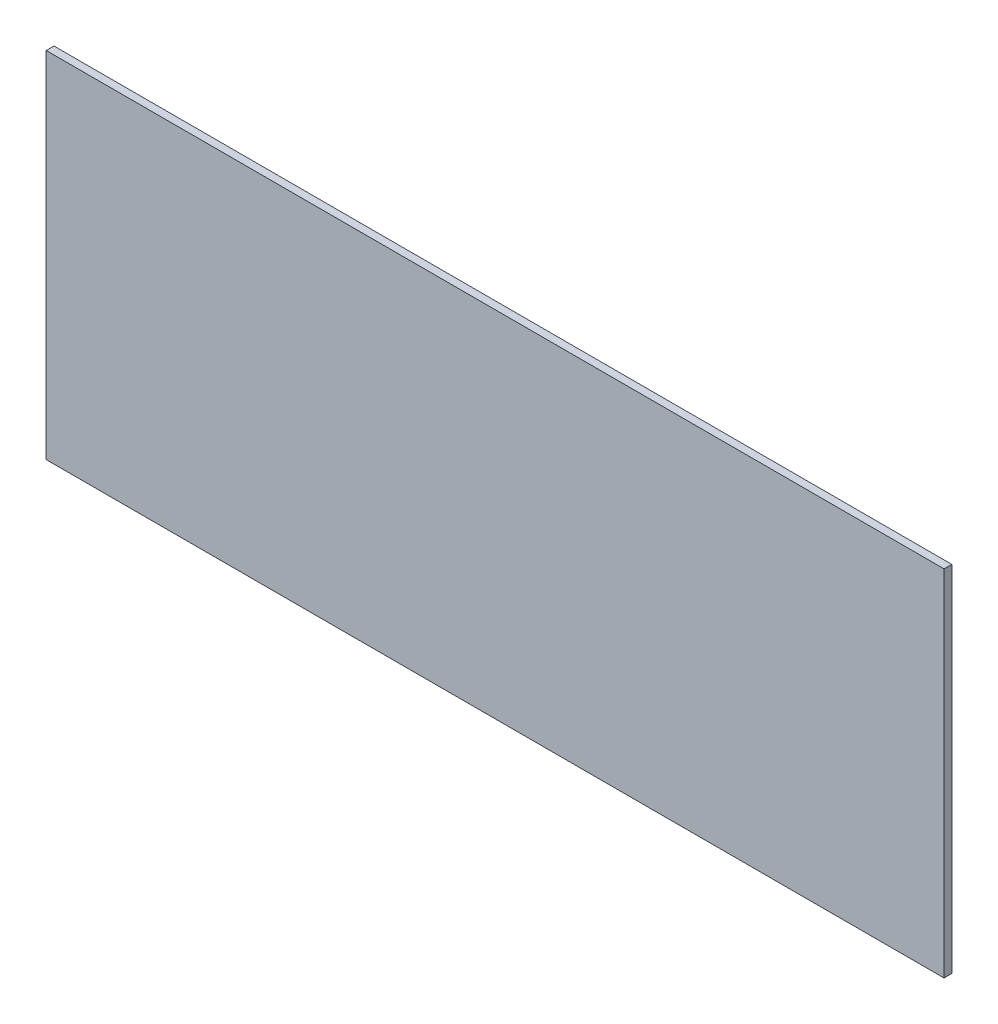
ISO-10303-21;
HEADER;
FILE_DESCRIPTION(('STEP AP214'),'2;1');
FILE_NAME('part.step','',(''),(''),'','','');
FILE_SCHEMA(('AUTOMOTIVE_DESIGN { 1 0 10303 214 1 1 1 1 }'));
ENDSEC;
DATA;
#1=APPLICATION_CONTEXT('core data for automotive mechanical design processes');
#2=APPLICATION_PROTOCOL_DEFINITION('international standard','automotive_design',2000,#1);
#3=PRODUCT_CONTEXT('',#1,'mechanical');
#4=PRODUCT('Part','Part','',(#3));
#5=PRODUCT_RELATED_PRODUCT_CATEGORY('part','',(#4));
#6=PRODUCT_DEFINITION_FORMATION('','',#4);
#7=PRODUCT_DEFINITION_CONTEXT('part definition',#1,'design');
#8=PRODUCT_DEFINITION('design','',#6,#7);
#9=PRODUCT_DEFINITION_SHAPE('','',#8);
#10=(LENGTH_UNIT() NAMED_UNIT(*) SI_UNIT(.MILLI.,.METRE.));
#11=(NAMED_UNIT(*) PLANE_ANGLE_UNIT() SI_UNIT($,.RADIAN.));
#12=(NAMED_UNIT(*) SI_UNIT($,.STERADIAN.) SOLID_ANGLE_UNIT());
#13=UNCERTAINTY_MEASURE_WITH_UNIT(LENGTH_MEASURE(1.E-05),#10,'distance_accuracy_value','');
#14=(GEOMETRIC_REPRESENTATION_CONTEXT(3) GLOBAL_UNCERTAINTY_ASSIGNED_CONTEXT((#13)) GLOBAL_UNIT_ASSIGNED_CONTEXT((#10,
#11,#12)) REPRESENTATION_CONTEXT('',''));
#15=CARTESIAN_POINT('',(0.,0.,0.));
#16=DIRECTION('',(0.,0.,1.));
#17=DIRECTION('',(1.,0.,0.));
#18=AXIS2_PLACEMENT_3D('',#15,#16,#17);
#19=CARTESIAN_POINT('',(66.8565481729192,-166.17884112834,-29.6063952225862));
#20=DIRECTION('',(0.,1.,0.));
#21=DIRECTION('',(1.,0.,0.));
#22=AXIS2_PLACEMENT_3D('',#19,#20,#21);
#23=PLANE('',#22);
#24=DIRECTION('',(1.,0.,0.));
#25=VECTOR('',#24,1.);
#26=CARTESIAN_POINT('',(90.6944481729192,-166.17884112834,-30.0435890832617));
#27=LINE('',#26,#25);
#28=CARTESIAN_POINT('',(66.8819481729192,-166.17884112834,-30.0435890832617));
#29=VERTEX_POINT('',#28);
#30=CARTESIAN_POINT('',(114.506948172919,-166.17884112834,-30.0435890832617));
#31=VERTEX_POINT('',#30);
#32=EDGE_CURVE('E77',#29,#31,#27,.T.);
#33=ORIENTED_EDGE('',*,*,#32,.F.);
#34=DIRECTION('',(0.,0.,1.));
#35=VECTOR('',#34,1.);
#36=CARTESIAN_POINT('',(66.8819481729192,-166.17884112834,-29.837692152924));
#37=LINE('',#36,#35);
#38=CARTESIAN_POINT('',(66.8819481729192,-166.17884112834,-29.6317952225862));
#39=VERTEX_POINT('',#38);
#40=EDGE_CURVE('E21',#29,#39,#37,.T.);
#41=ORIENTED_EDGE('',*,*,#40,.T.);
#42=DIRECTION('',(-1.,0.,0.));
#43=VECTOR('',#42,1.);
#44=CARTESIAN_POINT('',(90.6944481729192,-166.17884112834,-29.6317952225862));
#45=LINE('',#44,#43);
#46=CARTESIAN_POINT('',(114.506948172919,-166.17884112834,-29.6317952225862));
#47=VERTEX_POINT('',#46);
#48=EDGE_CURVE('E58',#47,#39,#45,.T.);
#49=ORIENTED_EDGE('',*,*,#48,.F.);
#50=DIRECTION('',(0.,0.,1.));
#51=VECTOR('',#50,1.);
#52=CARTESIAN_POINT('',(114.506948172919,-166.17884112834,-29.837692152924));
#53=LINE('',#52,#51);
#54=EDGE_CURVE('E61',#31,#47,#53,.T.);
#55=ORIENTED_EDGE('',*,*,#54,.F.);
#56=EDGE_LOOP('',(#33,#41,#49,#55));
#57=FACE_BOUND('',#56,.T.);
#58=ADVANCED_FACE('F17',(#57),#23,.T.);
#59=CARTESIAN_POINT('',(114.506948172919,-166.15344112834,-29.6063952225862));
#60=DIRECTION('',(1.,0.,0.));
#61=DIRECTION('',(0.,-1.,0.));
#62=AXIS2_PLACEMENT_3D('',#59,#60,#61);
#63=PLANE('',#62);
#64=DIRECTION('',(0.,-1.,0.));
#65=VECTOR('',#64,1.);
#66=CARTESIAN_POINT('',(114.506948172919,-175.57684112834,-30.0435890832617));
#67=LINE('',#66,#65);
#68=CARTESIAN_POINT('',(114.506948172919,-184.97484112834,-30.0435890832617));
#69=VERTEX_POINT('',#68);
#70=EDGE_CURVE('E74',#31,#69,#67,.T.);
#71=ORIENTED_EDGE('',*,*,#70,.F.);
#72=ORIENTED_EDGE('',*,*,#54,.T.);
#73=DIRECTION('',(0.,1.,0.));
#74=VECTOR('',#73,1.);
#75=CARTESIAN_POINT('',(114.506948172919,-175.57684112834,-29.6317952225862));
#76=LINE('',#75,#74);
#77=CARTESIAN_POINT('',(114.506948172919,-184.97484112834,-29.6317952225862));
#78=VERTEX_POINT('',#77);
#79=EDGE_CURVE('E71',#78,#47,#76,.T.);
#80=ORIENTED_EDGE('',*,*,#79,.F.);
#81=DIRECTION('',(0.,0.,1.));
#82=VECTOR('',#81,1.);
#83=CARTESIAN_POINT('',(114.506948172919,-184.97484112834,-29.837692152924));
#84=LINE('',#83,#82);
#85=EDGE_CURVE('E53',#69,#78,#84,.T.);
#86=ORIENTED_EDGE('',*,*,#85,.F.);
#87=EDGE_LOOP('',(#71,#72,#80,#86));
#88=FACE_BOUND('',#87,.T.);
#89=ADVANCED_FACE('F70',(#88),#63,.T.);
#90=CARTESIAN_POINT('',(114.532348172919,-184.97484112834,-29.6063952225862));
#91=DIRECTION('',(0.,-1.,0.));
#92=DIRECTION('',(-1.,0.,0.));
#93=AXIS2_PLACEMENT_3D('',#90,#91,#92);
#94=PLANE('',#93);
#95=DIRECTION('',(-1.,0.,0.));
#96=VECTOR('',#95,1.);
#97=CARTESIAN_POINT('',(90.6944481729192,-184.97484112834,-30.0435890832617));
#98=LINE('',#97,#96);
#99=CARTESIAN_POINT('',(66.8819481729192,-184.97484112834,-30.0435890832617));
#100=VERTEX_POINT('',#99);
#101=EDGE_CURVE('E85',#69,#100,#98,.T.);
#102=ORIENTED_EDGE('',*,*,#101,.F.);
#103=ORIENTED_EDGE('',*,*,#85,.T.);
#104=DIRECTION('',(1.,0.,0.));
#105=VECTOR('',#104,1.);
#106=CARTESIAN_POINT('',(90.6944481729192,-184.97484112834,-29.6317952225862));
#107=LINE('',#106,#105);
#108=CARTESIAN_POINT('',(66.8819481729192,-184.97484112834,-29.6317952225862));
#109=VERTEX_POINT('',#108);
#110=EDGE_CURVE('E67',#109,#78,#107,.T.);
#111=ORIENTED_EDGE('',*,*,#110,.F.);
#112=DIRECTION('',(0.,0.,-1.));
#113=VECTOR('',#112,1.);
#114=CARTESIAN_POINT('',(66.8819481729192,-184.97484112834,-29.837692152924));
#115=LINE('',#114,#113);
#116=EDGE_CURVE('E36',#109,#100,#115,.T.);
#117=ORIENTED_EDGE('',*,*,#116,.T.);
#118=EDGE_LOOP('',(#102,#103,#111,#117));
#119=FACE_BOUND('',#118,.T.);
#120=ADVANCED_FACE('F89',(#119),#94,.T.);
#121=CARTESIAN_POINT('',(114.532348172919,-185.00024112834,-29.6317952225862));
#122=DIRECTION('',(0.,0.,1.));
#123=DIRECTION('',(0.,1.,0.));
#124=AXIS2_PLACEMENT_3D('',#121,#122,#123);
#125=PLANE('',#124);
#126=ORIENTED_EDGE('',*,*,#110,.T.);
#127=ORIENTED_EDGE('',*,*,#79,.T.);
#128=ORIENTED_EDGE('',*,*,#48,.T.);
#129=DIRECTION('',(0.,1.,0.));
#130=VECTOR('',#129,1.);
#131=CARTESIAN_POINT('',(66.8819481729192,-175.57684112834,-29.6317952225862));
#132=LINE('',#131,#130);
#133=EDGE_CURVE('E27',#109,#39,#132,.T.);
#134=ORIENTED_EDGE('',*,*,#133,.F.);
#135=EDGE_LOOP('',(#126,#127,#128,#134));
#136=FACE_BOUND('',#135,.T.);
#137=ADVANCED_FACE('F76',(#136),#125,.T.);
#138=CARTESIAN_POINT('',(114.532348172919,-166.15344112834,-30.0435890832617));
#139=DIRECTION('',(0.,0.,-1.));
#140=DIRECTION('',(0.,-1.,0.));
#141=AXIS2_PLACEMENT_3D('',#138,#139,#140);
#142=PLANE('',#141);
#143=ORIENTED_EDGE('',*,*,#101,.T.);
#144=DIRECTION('',(0.,-1.,0.));
#145=VECTOR('',#144,1.);
#146=CARTESIAN_POINT('',(66.8819481729192,-175.57684112834,-30.0435890832617));
#147=LINE('',#146,#145);
#148=EDGE_CURVE('E11',#29,#100,#147,.T.);
#149=ORIENTED_EDGE('',*,*,#148,.F.);
#150=ORIENTED_EDGE('',*,*,#32,.T.);
#151=ORIENTED_EDGE('',*,*,#70,.T.);
#152=EDGE_LOOP('',(#143,#149,#150,#151));
#153=FACE_BOUND('',#152,.T.);
#154=ADVANCED_FACE('F97',(#153),#142,.T.);
#155=CARTESIAN_POINT('',(66.8819481729192,-185.00024112834,-29.6063952225862));
#156=DIRECTION('',(-1.,0.,0.));
#157=DIRECTION('',(0.,1.,0.));
#158=AXIS2_PLACEMENT_3D('',#155,#156,#157);
#159=PLANE('',#158);
#160=ORIENTED_EDGE('',*,*,#148,.T.);
#161=ORIENTED_EDGE('',*,*,#116,.F.);
#162=ORIENTED_EDGE('',*,*,#133,.T.);
#163=ORIENTED_EDGE('',*,*,#40,.F.);
#164=EDGE_LOOP('',(#160,#161,#162,#163));
#165=FACE_BOUND('',#164,.T.);
#166=ADVANCED_FACE('F19',(#165),#159,.T.);
#167=CLOSED_SHELL('',(#58,#89,#120,#137,#154,#166));
#168=MANIFOLD_SOLID_BREP('B1',#167);
#169=ADVANCED_BREP_SHAPE_REPRESENTATION('',(#18,#168),#14);
#170=SHAPE_DEFINITION_REPRESENTATION(#9,#169);
ENDSEC;
END-ISO-10303-21;
